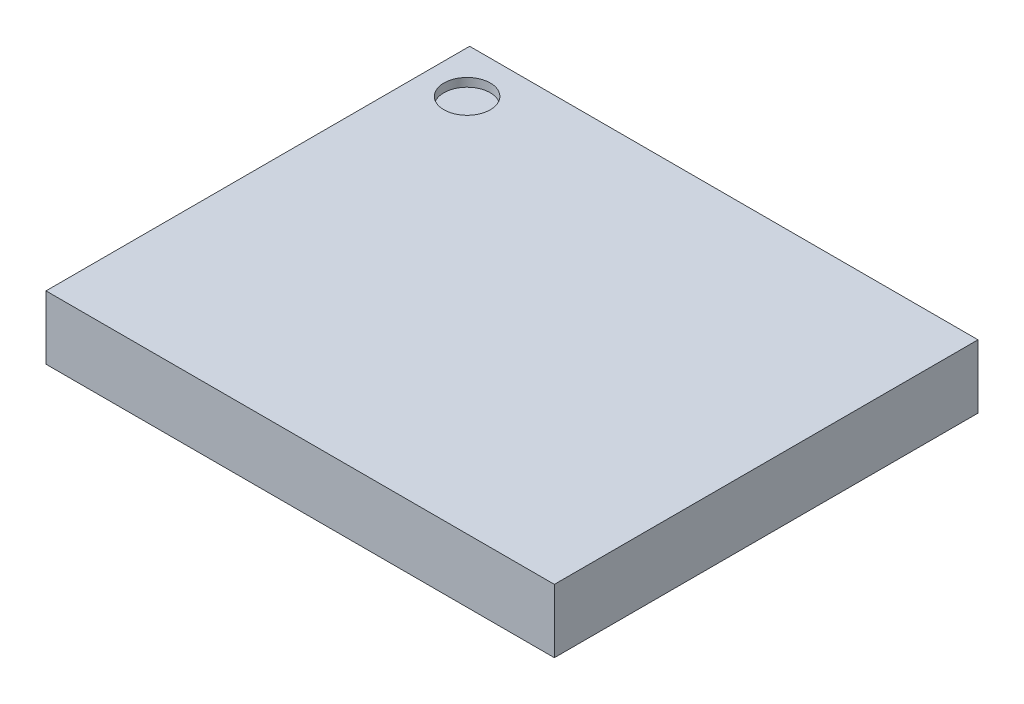
ISO-10303-21;
HEADER;
FILE_DESCRIPTION(('STEP AP214'),'2;1');
FILE_NAME('part.step','',(''),(''),'','','');
FILE_SCHEMA(('AUTOMOTIVE_DESIGN { 1 0 10303 214 1 1 1 1 }'));
ENDSEC;
DATA;
#1=APPLICATION_CONTEXT('core data for automotive mechanical design processes');
#2=APPLICATION_PROTOCOL_DEFINITION('international standard','automotive_design',2000,#1);
#3=PRODUCT_CONTEXT('',#1,'mechanical');
#4=PRODUCT('Part','Part','',(#3));
#5=PRODUCT_RELATED_PRODUCT_CATEGORY('part','',(#4));
#6=PRODUCT_DEFINITION_FORMATION('','',#4);
#7=PRODUCT_DEFINITION_CONTEXT('part definition',#1,'design');
#8=PRODUCT_DEFINITION('design','',#6,#7);
#9=PRODUCT_DEFINITION_SHAPE('','',#8);
#10=(LENGTH_UNIT() NAMED_UNIT(*) SI_UNIT(.MILLI.,.METRE.));
#11=(NAMED_UNIT(*) PLANE_ANGLE_UNIT() SI_UNIT($,.RADIAN.));
#12=(NAMED_UNIT(*) SI_UNIT($,.STERADIAN.) SOLID_ANGLE_UNIT());
#13=UNCERTAINTY_MEASURE_WITH_UNIT(LENGTH_MEASURE(1.E-05),#10,'distance_accuracy_value','');
#14=(GEOMETRIC_REPRESENTATION_CONTEXT(3) GLOBAL_UNCERTAINTY_ASSIGNED_CONTEXT((#13)) GLOBAL_UNIT_ASSIGNED_CONTEXT((#10,
#11,#12)) REPRESENTATION_CONTEXT('',''));
#15=CARTESIAN_POINT('',(0.,0.,0.));
#16=DIRECTION('',(0.,0.,1.));
#17=DIRECTION('',(1.,0.,0.));
#18=AXIS2_PLACEMENT_3D('',#15,#16,#17);
#19=CARTESIAN_POINT('',(3.,0.75,2.5));
#20=DIRECTION('',(-1.,0.,0.));
#21=DIRECTION('',(0.,0.,1.));
#22=AXIS2_PLACEMENT_3D('',#19,#20,#21);
#23=PLANE('',#22);
#24=DIRECTION('',(0.,0.,-1.));
#25=VECTOR('',#24,1.);
#26=CARTESIAN_POINT('',(3.,0.,2.5));
#27=LINE('',#26,#25);
#28=CARTESIAN_POINT('',(3.,0.,2.5));
#29=VERTEX_POINT('',#28);
#30=CARTESIAN_POINT('',(3.,0.,-2.5));
#31=VERTEX_POINT('',#30);
#32=EDGE_CURVE('E106',#29,#31,#27,.T.);
#33=ORIENTED_EDGE('',*,*,#32,.T.);
#34=DIRECTION('',(0.,-1.,0.));
#35=VECTOR('',#34,1.);
#36=CARTESIAN_POINT('',(3.,0.75,-2.5));
#37=LINE('',#36,#35);
#38=CARTESIAN_POINT('',(3.,0.75,-2.5));
#39=VERTEX_POINT('',#38);
#40=EDGE_CURVE('E11',#39,#31,#37,.T.);
#41=ORIENTED_EDGE('',*,*,#40,.F.);
#42=DIRECTION('',(0.,0.,-1.));
#43=VECTOR('',#42,1.);
#44=CARTESIAN_POINT('',(3.,0.75,2.5));
#45=LINE('',#44,#43);
#46=CARTESIAN_POINT('',(3.,0.75,2.5));
#47=VERTEX_POINT('',#46);
#48=EDGE_CURVE('E89',#47,#39,#45,.T.);
#49=ORIENTED_EDGE('',*,*,#48,.F.);
#50=DIRECTION('',(0.,-1.,0.));
#51=VECTOR('',#50,1.);
#52=CARTESIAN_POINT('',(3.,0.75,2.5));
#53=LINE('',#52,#51);
#54=EDGE_CURVE('E102',#47,#29,#53,.T.);
#55=ORIENTED_EDGE('',*,*,#54,.T.);
#56=EDGE_LOOP('',(#33,#41,#49,#55));
#57=FACE_BOUND('',#56,.T.);
#58=ADVANCED_FACE('F37',(#57),#23,.F.);
#59=CARTESIAN_POINT('',(-3.,0.75,-2.5));
#60=DIRECTION('',(0.,0.,1.));
#61=DIRECTION('',(1.,0.,0.));
#62=AXIS2_PLACEMENT_3D('',#59,#60,#61);
#63=PLANE('',#62);
#64=DIRECTION('',(-1.,0.,0.));
#65=VECTOR('',#64,1.);
#66=CARTESIAN_POINT('',(-3.,0.,-2.5));
#67=LINE('',#66,#65);
#68=CARTESIAN_POINT('',(-3.,0.,-2.5));
#69=VERTEX_POINT('',#68);
#70=EDGE_CURVE('E94',#31,#69,#67,.T.);
#71=ORIENTED_EDGE('',*,*,#70,.T.);
#72=DIRECTION('',(0.,-1.,0.));
#73=VECTOR('',#72,1.);
#74=CARTESIAN_POINT('',(-3.,0.75,-2.5));
#75=LINE('',#74,#73);
#76=CARTESIAN_POINT('',(-3.,0.75,-2.5));
#77=VERTEX_POINT('',#76);
#78=EDGE_CURVE('E46',#77,#69,#75,.T.);
#79=ORIENTED_EDGE('',*,*,#78,.F.);
#80=DIRECTION('',(-1.,0.,0.));
#81=VECTOR('',#80,1.);
#82=CARTESIAN_POINT('',(-3.,0.75,-2.5));
#83=LINE('',#82,#81);
#84=EDGE_CURVE('E84',#39,#77,#83,.T.);
#85=ORIENTED_EDGE('',*,*,#84,.F.);
#86=ORIENTED_EDGE('',*,*,#40,.T.);
#87=EDGE_LOOP('',(#71,#79,#85,#86));
#88=FACE_BOUND('',#87,.T.);
#89=ADVANCED_FACE('F93',(#88),#63,.F.);
#90=CARTESIAN_POINT('',(-3.,0.75,2.5));
#91=DIRECTION('',(1.,0.,0.));
#92=DIRECTION('',(0.,0.,-1.));
#93=AXIS2_PLACEMENT_3D('',#90,#91,#92);
#94=PLANE('',#93);
#95=DIRECTION('',(0.,0.,1.));
#96=VECTOR('',#95,1.);
#97=CARTESIAN_POINT('',(-3.,0.,2.5));
#98=LINE('',#97,#96);
#99=CARTESIAN_POINT('',(-3.,0.,2.5));
#100=VERTEX_POINT('',#99);
#101=EDGE_CURVE('E71',#69,#100,#98,.T.);
#102=ORIENTED_EDGE('',*,*,#101,.T.);
#103=DIRECTION('',(0.,-1.,0.));
#104=VECTOR('',#103,1.);
#105=CARTESIAN_POINT('',(-3.,0.75,2.5));
#106=LINE('',#105,#104);
#107=CARTESIAN_POINT('',(-3.,0.75,2.5));
#108=VERTEX_POINT('',#107);
#109=EDGE_CURVE('E96',#108,#100,#106,.T.);
#110=ORIENTED_EDGE('',*,*,#109,.F.);
#111=DIRECTION('',(0.,0.,1.));
#112=VECTOR('',#111,1.);
#113=CARTESIAN_POINT('',(-3.,0.75,2.5));
#114=LINE('',#113,#112);
#115=EDGE_CURVE('E87',#77,#108,#114,.T.);
#116=ORIENTED_EDGE('',*,*,#115,.F.);
#117=ORIENTED_EDGE('',*,*,#78,.T.);
#118=EDGE_LOOP('',(#102,#110,#116,#117));
#119=FACE_BOUND('',#118,.T.);
#120=ADVANCED_FACE('F97',(#119),#94,.F.);
#121=CARTESIAN_POINT('',(-3.,0.75,2.5));
#122=DIRECTION('',(0.,0.,-1.));
#123=DIRECTION('',(-1.,0.,0.));
#124=AXIS2_PLACEMENT_3D('',#121,#122,#123);
#125=PLANE('',#124);
#126=DIRECTION('',(1.,0.,0.));
#127=VECTOR('',#126,1.);
#128=CARTESIAN_POINT('',(-3.,0.,2.5));
#129=LINE('',#128,#127);
#130=EDGE_CURVE('E77',#100,#29,#129,.T.);
#131=ORIENTED_EDGE('',*,*,#130,.T.);
#132=ORIENTED_EDGE('',*,*,#54,.F.);
#133=DIRECTION('',(1.,0.,0.));
#134=VECTOR('',#133,1.);
#135=CARTESIAN_POINT('',(-3.,0.75,2.5));
#136=LINE('',#135,#134);
#137=EDGE_CURVE('E54',#108,#47,#136,.T.);
#138=ORIENTED_EDGE('',*,*,#137,.F.);
#139=ORIENTED_EDGE('',*,*,#109,.T.);
#140=EDGE_LOOP('',(#131,#132,#138,#139));
#141=FACE_BOUND('',#140,.T.);
#142=ADVANCED_FACE('F120',(#141),#125,.F.);
#143=CARTESIAN_POINT('',(0.,0.75,0.));
#144=DIRECTION('',(0.,-1.,0.));
#145=DIRECTION('',(0.,0.,-1.));
#146=AXIS2_PLACEMENT_3D('',#143,#144,#145);
#147=PLANE('',#146);
#148=CARTESIAN_POINT('',(-2.50288926665121,0.75,-1.97285266892777));
#149=DIRECTION('',(0.,1.,0.));
#150=DIRECTION('',(0.,0.,1.));
#151=AXIS2_PLACEMENT_3D('',#148,#149,#150);
#152=CIRCLE('',#151,0.273853809698511);
#153=CARTESIAN_POINT('',(-2.50288926665121,0.75,-1.69899885922926));
#154=VERTEX_POINT('',#153);
#155=EDGE_CURVE('E128',#154,#154,#152,.T.);
#156=ORIENTED_EDGE('',*,*,#155,.F.);
#157=EDGE_LOOP('',(#156));
#158=FACE_BOUND('',#157,.T.);
#159=ORIENTED_EDGE('',*,*,#48,.T.);
#160=ORIENTED_EDGE('',*,*,#84,.T.);
#161=ORIENTED_EDGE('',*,*,#115,.T.);
#162=ORIENTED_EDGE('',*,*,#137,.T.);
#163=EDGE_LOOP('',(#159,#160,#161,#162));
#164=FACE_BOUND('',#163,.T.);
#165=ADVANCED_FACE('F85',(#158,#164),#147,.F.);
#166=CARTESIAN_POINT('',(0.,0.,0.));
#167=DIRECTION('',(0.,-1.,0.));
#168=DIRECTION('',(0.,0.,-1.));
#169=AXIS2_PLACEMENT_3D('',#166,#167,#168);
#170=PLANE('',#169);
#171=ORIENTED_EDGE('',*,*,#32,.F.);
#172=ORIENTED_EDGE('',*,*,#130,.F.);
#173=ORIENTED_EDGE('',*,*,#101,.F.);
#174=ORIENTED_EDGE('',*,*,#70,.F.);
#175=EDGE_LOOP('',(#171,#172,#173,#174));
#176=FACE_BOUND('',#175,.T.);
#177=ADVANCED_FACE('F123',(#176),#170,.T.);
#178=CARTESIAN_POINT('',(-2.50288926665121,0.65,-1.97285266892777));
#179=DIRECTION('',(0.,1.,0.));
#180=DIRECTION('',(0.,0.,1.));
#181=AXIS2_PLACEMENT_3D('',#178,#179,#180);
#182=CYLINDRICAL_SURFACE('',#181,0.273853809698511);
#183=CARTESIAN_POINT('',(-2.50288926665121,0.65,-1.97285266892777));
#184=DIRECTION('',(0.,1.,0.));
#185=DIRECTION('',(0.,0.,1.));
#186=AXIS2_PLACEMENT_3D('',#183,#184,#185);
#187=CIRCLE('',#186,0.273853809698511);
#188=CARTESIAN_POINT('',(-2.50288926665121,0.65,-1.69899885922926));
#189=VERTEX_POINT('',#188);
#190=EDGE_CURVE('E110',#189,#189,#187,.T.);
#191=ORIENTED_EDGE('',*,*,#190,.F.);
#192=EDGE_LOOP('',(#191));
#193=FACE_BOUND('',#192,.T.);
#194=ORIENTED_EDGE('',*,*,#155,.T.);
#195=EDGE_LOOP('',(#194));
#196=FACE_BOUND('',#195,.T.);
#197=ADVANCED_FACE('F136',(#193,#196),#182,.F.);
#198=CARTESIAN_POINT('',(-2.50288926665121,0.65,-1.97285266892777));
#199=DIRECTION('',(0.,1.,0.));
#200=DIRECTION('',(0.,0.,1.));
#201=AXIS2_PLACEMENT_3D('',#198,#199,#200);
#202=PLANE('',#201);
#203=ORIENTED_EDGE('',*,*,#190,.T.);
#204=EDGE_LOOP('',(#203));
#205=FACE_BOUND('',#204,.T.);
#206=ADVANCED_FACE('F134',(#205),#202,.T.);
#207=CLOSED_SHELL('',(#58,#89,#120,#142,#165,#177,#197,#206));
#208=MANIFOLD_SOLID_BREP('B2',#207);
#209=ADVANCED_BREP_SHAPE_REPRESENTATION('',(#18,#208),#14);
#210=SHAPE_DEFINITION_REPRESENTATION(#9,#209);
ENDSEC;
END-ISO-10303-21;
